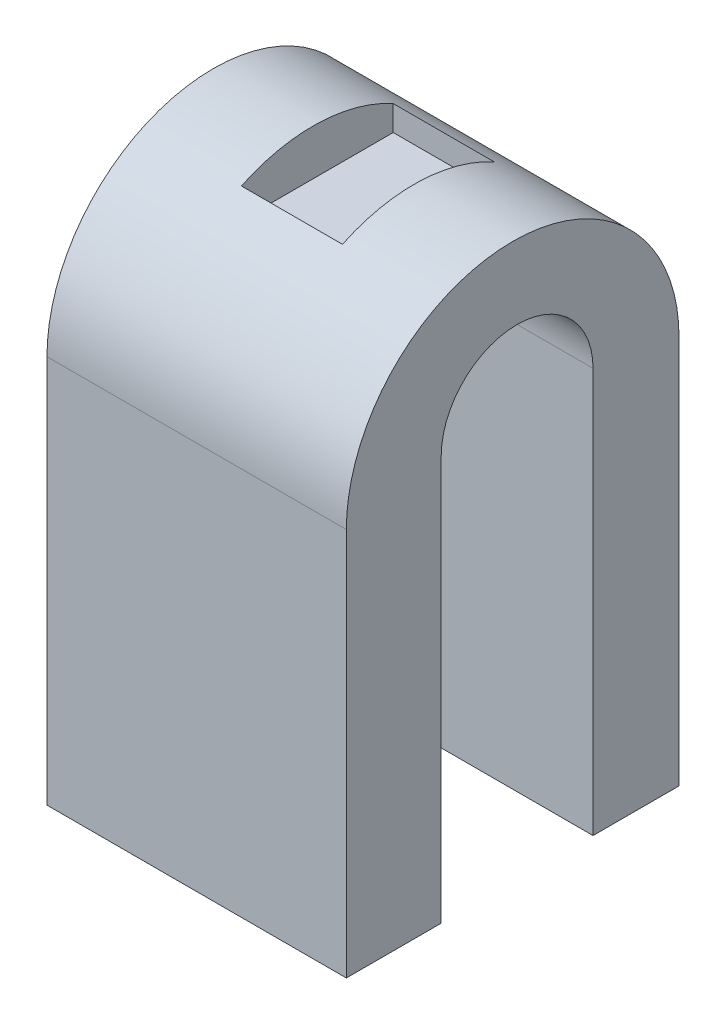
ISO-10303-21;
HEADER;
FILE_DESCRIPTION(('STEP AP214'),'2;1');
FILE_NAME('part.step','',(''),(''),'','','');
FILE_SCHEMA(('AUTOMOTIVE_DESIGN { 1 0 10303 214 1 1 1 1 }'));
ENDSEC;
DATA;
#1=APPLICATION_CONTEXT('core data for automotive mechanical design processes');
#2=APPLICATION_PROTOCOL_DEFINITION('international standard','automotive_design',2000,#1);
#3=PRODUCT_CONTEXT('',#1,'mechanical');
#4=PRODUCT('Part','Part','',(#3));
#5=PRODUCT_RELATED_PRODUCT_CATEGORY('part','',(#4));
#6=PRODUCT_DEFINITION_FORMATION('','',#4);
#7=PRODUCT_DEFINITION_CONTEXT('part definition',#1,'design');
#8=PRODUCT_DEFINITION('design','',#6,#7);
#9=PRODUCT_DEFINITION_SHAPE('','',#8);
#10=(LENGTH_UNIT() NAMED_UNIT(*) SI_UNIT(.MILLI.,.METRE.));
#11=(NAMED_UNIT(*) PLANE_ANGLE_UNIT() SI_UNIT($,.RADIAN.));
#12=(NAMED_UNIT(*) SI_UNIT($,.STERADIAN.) SOLID_ANGLE_UNIT());
#13=UNCERTAINTY_MEASURE_WITH_UNIT(LENGTH_MEASURE(1.E-05),#10,'distance_accuracy_value','');
#14=(GEOMETRIC_REPRESENTATION_CONTEXT(3) GLOBAL_UNCERTAINTY_ASSIGNED_CONTEXT((#13)) GLOBAL_UNIT_ASSIGNED_CONTEXT((#10,
#11,#12)) REPRESENTATION_CONTEXT('',''));
#15=CARTESIAN_POINT('',(0.,0.,0.));
#16=DIRECTION('',(0.,0.,1.));
#17=DIRECTION('',(1.,0.,0.));
#18=AXIS2_PLACEMENT_3D('',#15,#16,#17);
#19=CARTESIAN_POINT('',(50.,64.8618826991821,-27.7809166707894));
#20=DIRECTION('',(-1.,0.,0.));
#21=DIRECTION('',(0.,0.,1.));
#22=AXIS2_PLACEMENT_3D('',#19,#20,#21);
#23=CYLINDRICAL_SURFACE('',#22,27.7809166707894);
#24=CARTESIAN_POINT('',(0.,64.8618826991821,-27.7809166707894));
#25=DIRECTION('',(1.,0.,0.));
#26=DIRECTION('',(0.,0.,-1.));
#27=AXIS2_PLACEMENT_3D('',#24,#25,#26);
#28=CIRCLE('',#27,27.7809166707894);
#29=CARTESIAN_POINT('',(0.,64.8618826991821,-55.5618333415788));
#30=VERTEX_POINT('',#29);
#31=CARTESIAN_POINT('',(0.,64.8618826991821,0.));
#32=VERTEX_POINT('',#31);
#33=EDGE_CURVE('E202',#30,#32,#28,.T.);
#34=ORIENTED_EDGE('',*,*,#33,.T.);
#35=DIRECTION('',(-1.,0.,0.));
#36=VECTOR('',#35,1.);
#37=CARTESIAN_POINT('',(50.,64.8618826991821,0.));
#38=LINE('',#37,#36);
#39=CARTESIAN_POINT('',(50.,64.8618826991821,0.));
#40=VERTEX_POINT('',#39);
#41=EDGE_CURVE('E251',#40,#32,#38,.T.);
#42=ORIENTED_EDGE('',*,*,#41,.F.);
#43=CARTESIAN_POINT('',(50.,64.8618826991821,-27.7809166707894));
#44=DIRECTION('',(1.,0.,0.));
#45=DIRECTION('',(0.,0.,-1.));
#46=AXIS2_PLACEMENT_3D('',#43,#44,#45);
#47=CIRCLE('',#46,27.7809166707894);
#48=CARTESIAN_POINT('',(50.,64.8618826991821,-55.5618333415788));
#49=VERTEX_POINT('',#48);
#50=EDGE_CURVE('E210',#49,#40,#47,.T.);
#51=ORIENTED_EDGE('',*,*,#50,.F.);
#52=DIRECTION('',(-1.,0.,0.));
#53=VECTOR('',#52,1.);
#54=CARTESIAN_POINT('',(50.,64.8618826991821,-55.5618333415788));
#55=LINE('',#54,#53);
#56=EDGE_CURVE('E226',#49,#30,#55,.T.);
#57=ORIENTED_EDGE('',*,*,#56,.T.);
#58=EDGE_LOOP('',(#34,#42,#51,#57));
#59=FACE_BOUND('',#58,.T.);
#60=CARTESIAN_POINT('',(33.5085469946007,64.8618826991821,-27.7809166707894));
#61=DIRECTION('',(-1.,0.,0.));
#62=DIRECTION('',(0.,0.,1.));
#63=AXIS2_PLACEMENT_3D('',#60,#61,#62);
#64=CIRCLE('',#63,27.7809166707894);
#65=CARTESIAN_POINT('',(33.5085469946007,89.9470743785203,-15.8430571691783));
#66=VERTEX_POINT('',#65);
#67=CARTESIAN_POINT('',(33.5085469946007,89.1886886851724,-41.1967968725999));
#68=VERTEX_POINT('',#67);
#69=EDGE_CURVE('E254',#66,#68,#64,.T.);
#70=ORIENTED_EDGE('',*,*,#69,.F.);
#71=DIRECTION('',(-1.,0.,0.));
#72=VECTOR('',#71,1.);
#73=CARTESIAN_POINT('',(50.,89.9470743785203,-15.8430571691783));
#74=LINE('',#73,#72);
#75=CARTESIAN_POINT('',(16.6327028117731,89.9470743785203,-15.8430571691783));
#76=VERTEX_POINT('',#75);
#77=EDGE_CURVE('E11',#76,#66,#74,.F.);
#78=ORIENTED_EDGE('',*,*,#77,.F.);
#79=CARTESIAN_POINT('',(16.6327028117731,64.8618826991821,-27.7809166707894));
#80=DIRECTION('',(1.,0.,0.));
#81=DIRECTION('',(0.,0.,-1.));
#82=AXIS2_PLACEMENT_3D('',#79,#80,#81);
#83=CIRCLE('',#82,27.7809166707894);
#84=CARTESIAN_POINT('',(16.6327028117731,89.1886886851724,-41.1967968725999));
#85=VERTEX_POINT('',#84);
#86=EDGE_CURVE('E144',#85,#76,#83,.T.);
#87=ORIENTED_EDGE('',*,*,#86,.F.);
#88=DIRECTION('',(-1.,0.,0.));
#89=VECTOR('',#88,1.);
#90=CARTESIAN_POINT('',(50.,89.1886886851724,-41.1967968725999));
#91=LINE('',#90,#89);
#92=EDGE_CURVE('E55',#68,#85,#91,.T.);
#93=ORIENTED_EDGE('',*,*,#92,.F.);
#94=EDGE_LOOP('',(#70,#78,#87,#93));
#95=FACE_BOUND('',#94,.T.);
#96=ADVANCED_FACE('F47',(#59,#95),#23,.T.);
#97=CARTESIAN_POINT('',(50.,0.,0.));
#98=DIRECTION('',(0.,1.,0.));
#99=DIRECTION('',(0.,0.,1.));
#100=AXIS2_PLACEMENT_3D('',#97,#98,#99);
#101=PLANE('',#100);
#102=DIRECTION('',(1.,0.,0.));
#103=VECTOR('',#102,1.);
#104=CARTESIAN_POINT('',(0.,0.,-41.1967968725999));
#105=LINE('',#104,#103);
#106=CARTESIAN_POINT('',(0.,0.,-41.1967968725999));
#107=VERTEX_POINT('',#106);
#108=CARTESIAN_POINT('',(50.,0.,-41.1967968725999));
#109=VERTEX_POINT('',#108);
#110=EDGE_CURVE('E203',#107,#109,#105,.T.);
#111=ORIENTED_EDGE('',*,*,#110,.F.);
#112=DIRECTION('',(0.,0.,-1.));
#113=VECTOR('',#112,1.);
#114=CARTESIAN_POINT('',(0.,0.,0.));
#115=LINE('',#114,#113);
#116=CARTESIAN_POINT('',(0.,0.,-55.5618333415788));
#117=VERTEX_POINT('',#116);
#118=EDGE_CURVE('E234',#107,#117,#115,.T.);
#119=ORIENTED_EDGE('',*,*,#118,.T.);
#120=DIRECTION('',(-1.,0.,0.));
#121=VECTOR('',#120,1.);
#122=CARTESIAN_POINT('',(50.,0.,-55.5618333415788));
#123=LINE('',#122,#121);
#124=CARTESIAN_POINT('',(50.,0.,-55.5618333415788));
#125=VERTEX_POINT('',#124);
#126=EDGE_CURVE('E244',#125,#117,#123,.T.);
#127=ORIENTED_EDGE('',*,*,#126,.F.);
#128=DIRECTION('',(0.,0.,-1.));
#129=VECTOR('',#128,1.);
#130=CARTESIAN_POINT('',(50.,0.,0.));
#131=LINE('',#130,#129);
#132=EDGE_CURVE('E218',#109,#125,#131,.T.);
#133=ORIENTED_EDGE('',*,*,#132,.F.);
#134=EDGE_LOOP('',(#111,#119,#127,#133));
#135=FACE_BOUND('',#134,.T.);
#136=ADVANCED_FACE('F273',(#135),#101,.F.);
#137=CARTESIAN_POINT('',(50.,0.,0.));
#138=DIRECTION('',(1.,0.,0.));
#139=DIRECTION('',(0.,0.,-1.));
#140=AXIS2_PLACEMENT_3D('',#137,#138,#139);
#141=PLANE('',#140);
#142=CARTESIAN_POINT('',(50.,67.5821589878552,-28.5199270208891));
#143=DIRECTION('',(1.,0.,0.));
#144=DIRECTION('',(0.,0.,-1.));
#145=AXIS2_PLACEMENT_3D('',#142,#143,#144);
#146=CIRCLE('',#145,12.6768698517108);
#147=CARTESIAN_POINT('',(50.,67.5821589878552,-41.1967968725999));
#148=VERTEX_POINT('',#147);
#149=CARTESIAN_POINT('',(50.,67.5821589878552,-15.8430571691783));
#150=VERTEX_POINT('',#149);
#151=EDGE_CURVE('E148',#148,#150,#146,.T.);
#152=ORIENTED_EDGE('',*,*,#151,.F.);
#153=DIRECTION('',(0.,-1.,0.));
#154=VECTOR('',#153,1.);
#155=CARTESIAN_POINT('',(50.,0.,-41.1967968725999));
#156=LINE('',#155,#154);
#157=EDGE_CURVE('E183',#148,#109,#156,.T.);
#158=ORIENTED_EDGE('',*,*,#157,.T.);
#159=ORIENTED_EDGE('',*,*,#132,.T.);
#160=DIRECTION('',(0.,1.,0.));
#161=VECTOR('',#160,1.);
#162=CARTESIAN_POINT('',(50.,0.,-55.5618333415788));
#163=LINE('',#162,#161);
#164=EDGE_CURVE('E223',#125,#49,#163,.T.);
#165=ORIENTED_EDGE('',*,*,#164,.T.);
#166=ORIENTED_EDGE('',*,*,#50,.T.);
#167=DIRECTION('',(0.,1.,0.));
#168=VECTOR('',#167,1.);
#169=CARTESIAN_POINT('',(50.,0.,0.));
#170=LINE('',#169,#168);
#171=CARTESIAN_POINT('',(50.,0.,0.));
#172=VERTEX_POINT('',#171);
#173=EDGE_CURVE('E213',#172,#40,#170,.T.);
#174=ORIENTED_EDGE('',*,*,#173,.F.);
#175=CARTESIAN_POINT('',(50.,0.,-15.8430571691783));
#176=VERTEX_POINT('',#175);
#177=EDGE_CURVE('E219',#172,#176,#131,.T.);
#178=ORIENTED_EDGE('',*,*,#177,.T.);
#179=DIRECTION('',(0.,-1.,0.));
#180=VECTOR('',#179,1.);
#181=CARTESIAN_POINT('',(50.,0.,-15.8430571691783));
#182=LINE('',#181,#180);
#183=EDGE_CURVE('E193',#150,#176,#182,.T.);
#184=ORIENTED_EDGE('',*,*,#183,.F.);
#185=EDGE_LOOP('',(#152,#158,#159,#165,#166,#174,#178,#184));
#186=FACE_BOUND('',#185,.T.);
#187=ADVANCED_FACE('F280',(#186),#141,.T.);
#188=CARTESIAN_POINT('',(0.,0.,0.));
#189=DIRECTION('',(1.,0.,0.));
#190=DIRECTION('',(0.,0.,-1.));
#191=AXIS2_PLACEMENT_3D('',#188,#189,#190);
#192=PLANE('',#191);
#193=DIRECTION('',(0.,-1.,0.));
#194=VECTOR('',#193,1.);
#195=CARTESIAN_POINT('',(0.,0.,-41.1967968725999));
#196=LINE('',#195,#194);
#197=CARTESIAN_POINT('',(0.,67.5821589878552,-41.1967968725999));
#198=VERTEX_POINT('',#197);
#199=EDGE_CURVE('E186',#198,#107,#196,.T.);
#200=ORIENTED_EDGE('',*,*,#199,.F.);
#201=CARTESIAN_POINT('',(0.,67.5821589878552,-28.5199270208891));
#202=DIRECTION('',(1.,0.,0.));
#203=DIRECTION('',(0.,0.,-1.));
#204=AXIS2_PLACEMENT_3D('',#201,#202,#203);
#205=CIRCLE('',#204,12.6768698517108);
#206=CARTESIAN_POINT('',(0.,67.5821589878552,-15.8430571691783));
#207=VERTEX_POINT('',#206);
#208=EDGE_CURVE('E178',#198,#207,#205,.T.);
#209=ORIENTED_EDGE('',*,*,#208,.T.);
#210=DIRECTION('',(0.,-1.,0.));
#211=VECTOR('',#210,1.);
#212=CARTESIAN_POINT('',(0.,0.,-15.8430571691783));
#213=LINE('',#212,#211);
#214=CARTESIAN_POINT('',(0.,0.,-15.8430571691783));
#215=VERTEX_POINT('',#214);
#216=EDGE_CURVE('E182',#207,#215,#213,.T.);
#217=ORIENTED_EDGE('',*,*,#216,.T.);
#218=CARTESIAN_POINT('',(0.,0.,0.));
#219=VERTEX_POINT('',#218);
#220=EDGE_CURVE('E235',#219,#215,#115,.T.);
#221=ORIENTED_EDGE('',*,*,#220,.F.);
#222=DIRECTION('',(0.,1.,0.));
#223=VECTOR('',#222,1.);
#224=CARTESIAN_POINT('',(0.,0.,0.));
#225=LINE('',#224,#223);
#226=EDGE_CURVE('E230',#219,#32,#225,.T.);
#227=ORIENTED_EDGE('',*,*,#226,.T.);
#228=ORIENTED_EDGE('',*,*,#33,.F.);
#229=DIRECTION('',(0.,1.,0.));
#230=VECTOR('',#229,1.);
#231=CARTESIAN_POINT('',(0.,0.,-55.5618333415788));
#232=LINE('',#231,#230);
#233=EDGE_CURVE('E214',#117,#30,#232,.T.);
#234=ORIENTED_EDGE('',*,*,#233,.F.);
#235=ORIENTED_EDGE('',*,*,#118,.F.);
#236=EDGE_LOOP('',(#200,#209,#217,#221,#227,#228,#234,#235));
#237=FACE_BOUND('',#236,.T.);
#238=ADVANCED_FACE('F293',(#237),#192,.F.);
#239=CARTESIAN_POINT('',(50.,0.,0.));
#240=DIRECTION('',(0.,0.,1.));
#241=DIRECTION('',(1.,0.,0.));
#242=AXIS2_PLACEMENT_3D('',#239,#240,#241);
#243=PLANE('',#242);
#244=ORIENTED_EDGE('',*,*,#226,.F.);
#245=DIRECTION('',(-1.,0.,0.));
#246=VECTOR('',#245,1.);
#247=CARTESIAN_POINT('',(50.,0.,0.));
#248=LINE('',#247,#246);
#249=EDGE_CURVE('E248',#172,#219,#248,.T.);
#250=ORIENTED_EDGE('',*,*,#249,.F.);
#251=ORIENTED_EDGE('',*,*,#173,.T.);
#252=ORIENTED_EDGE('',*,*,#41,.T.);
#253=EDGE_LOOP('',(#244,#250,#251,#252));
#254=FACE_BOUND('',#253,.T.);
#255=ADVANCED_FACE('F295',(#254),#243,.T.);
#256=ORIENTED_EDGE('',*,*,#220,.T.);
#257=DIRECTION('',(1.,0.,0.));
#258=VECTOR('',#257,1.);
#259=CARTESIAN_POINT('',(0.,0.,-15.8430571691783));
#260=LINE('',#259,#258);
#261=EDGE_CURVE('E70',#215,#176,#260,.T.);
#262=ORIENTED_EDGE('',*,*,#261,.T.);
#263=ORIENTED_EDGE('',*,*,#177,.F.);
#264=ORIENTED_EDGE('',*,*,#249,.T.);
#265=EDGE_LOOP('',(#256,#262,#263,#264));
#266=FACE_BOUND('',#265,.T.);
#267=ADVANCED_FACE('F283',(#266),#101,.F.);
#268=CARTESIAN_POINT('',(50.,0.,-55.5618333415788));
#269=DIRECTION('',(0.,0.,1.));
#270=DIRECTION('',(1.,0.,0.));
#271=AXIS2_PLACEMENT_3D('',#268,#269,#270);
#272=PLANE('',#271);
#273=ORIENTED_EDGE('',*,*,#233,.T.);
#274=ORIENTED_EDGE('',*,*,#56,.F.);
#275=ORIENTED_EDGE('',*,*,#164,.F.);
#276=ORIENTED_EDGE('',*,*,#126,.T.);
#277=EDGE_LOOP('',(#273,#274,#275,#276));
#278=FACE_BOUND('',#277,.T.);
#279=ADVANCED_FACE('F305',(#278),#272,.F.);
#280=CARTESIAN_POINT('',(0.,67.5821589878552,-28.5199270208891));
#281=DIRECTION('',(1.,0.,0.));
#282=DIRECTION('',(0.,0.,-1.));
#283=AXIS2_PLACEMENT_3D('',#280,#281,#282);
#284=CYLINDRICAL_SURFACE('',#283,12.6768698517108);
#285=ORIENTED_EDGE('',*,*,#151,.T.);
#286=DIRECTION('',(1.,0.,0.));
#287=VECTOR('',#286,1.);
#288=CARTESIAN_POINT('',(0.,67.5821589878552,-15.8430571691783));
#289=LINE('',#288,#287);
#290=EDGE_CURVE('E189',#207,#150,#289,.T.);
#291=ORIENTED_EDGE('',*,*,#290,.F.);
#292=ORIENTED_EDGE('',*,*,#208,.F.);
#293=DIRECTION('',(1.,0.,0.));
#294=VECTOR('',#293,1.);
#295=CARTESIAN_POINT('',(0.,67.5821589878552,-41.1967968725999));
#296=LINE('',#295,#294);
#297=EDGE_CURVE('E199',#198,#148,#296,.T.);
#298=ORIENTED_EDGE('',*,*,#297,.T.);
#299=EDGE_LOOP('',(#285,#291,#292,#298));
#300=FACE_BOUND('',#299,.T.);
#301=ADVANCED_FACE('F314',(#300),#284,.F.);
#302=CARTESIAN_POINT('',(0.,0.,-41.1967968725999));
#303=DIRECTION('',(0.,0.,1.));
#304=DIRECTION('',(1.,0.,0.));
#305=AXIS2_PLACEMENT_3D('',#302,#303,#304);
#306=PLANE('',#305);
#307=ORIENTED_EDGE('',*,*,#157,.F.);
#308=ORIENTED_EDGE('',*,*,#297,.F.);
#309=ORIENTED_EDGE('',*,*,#199,.T.);
#310=ORIENTED_EDGE('',*,*,#110,.T.);
#311=EDGE_LOOP('',(#307,#308,#309,#310));
#312=FACE_BOUND('',#311,.T.);
#313=ADVANCED_FACE('F312',(#312),#306,.T.);
#314=CARTESIAN_POINT('',(0.,0.,-15.8430571691783));
#315=DIRECTION('',(0.,0.,1.));
#316=DIRECTION('',(1.,0.,0.));
#317=AXIS2_PLACEMENT_3D('',#314,#315,#316);
#318=PLANE('',#317);
#319=ORIENTED_EDGE('',*,*,#183,.T.);
#320=ORIENTED_EDGE('',*,*,#261,.F.);
#321=ORIENTED_EDGE('',*,*,#216,.F.);
#322=ORIENTED_EDGE('',*,*,#290,.T.);
#323=EDGE_LOOP('',(#319,#320,#321,#322));
#324=FACE_BOUND('',#323,.T.);
#325=ADVANCED_FACE('F330',(#324),#318,.F.);
#326=CARTESIAN_POINT('',(16.6327028117731,92.6427993699715,-41.1967968725999));
#327=DIRECTION('',(1.,0.,0.));
#328=DIRECTION('',(0.,0.,-1.));
#329=AXIS2_PLACEMENT_3D('',#326,#327,#328);
#330=PLANE('',#329);
#331=DIRECTION('',(0.,-1.,0.));
#332=VECTOR('',#331,1.);
#333=CARTESIAN_POINT('',(16.6327028117731,92.6427993699715,-41.1967968725999));
#334=LINE('',#333,#332);
#335=CARTESIAN_POINT('',(16.6327028117731,85.,-41.1967968725999));
#336=VERTEX_POINT('',#335);
#337=EDGE_CURVE('E171',#85,#336,#334,.T.);
#338=ORIENTED_EDGE('',*,*,#337,.F.);
#339=ORIENTED_EDGE('',*,*,#86,.T.);
#340=DIRECTION('',(0.,-1.,0.));
#341=VECTOR('',#340,1.);
#342=CARTESIAN_POINT('',(16.6327028117731,92.6427993699715,-15.8430571691783));
#343=LINE('',#342,#341);
#344=CARTESIAN_POINT('',(16.6327028117731,85.,-15.8430571691783));
#345=VERTEX_POINT('',#344);
#346=EDGE_CURVE('E138',#76,#345,#343,.T.);
#347=ORIENTED_EDGE('',*,*,#346,.T.);
#348=DIRECTION('',(0.,0.,1.));
#349=VECTOR('',#348,1.);
#350=CARTESIAN_POINT('',(16.6327028117731,85.,-41.1967968725999));
#351=LINE('',#350,#349);
#352=EDGE_CURVE('E143',#336,#345,#351,.T.);
#353=ORIENTED_EDGE('',*,*,#352,.F.);
#354=EDGE_LOOP('',(#338,#339,#347,#353));
#355=FACE_BOUND('',#354,.T.);
#356=ADVANCED_FACE('F141',(#355),#330,.T.);
#357=CARTESIAN_POINT('',(16.6327028117731,92.6427993699715,-15.8430571691783));
#358=DIRECTION('',(0.,0.,-1.));
#359=DIRECTION('',(-1.,0.,0.));
#360=AXIS2_PLACEMENT_3D('',#357,#358,#359);
#361=PLANE('',#360);
#362=ORIENTED_EDGE('',*,*,#77,.T.);
#363=DIRECTION('',(0.,-1.,0.));
#364=VECTOR('',#363,1.);
#365=CARTESIAN_POINT('',(33.5085469946007,92.6427993699715,-15.8430571691783));
#366=LINE('',#365,#364);
#367=CARTESIAN_POINT('',(33.5085469946007,85.,-15.8430571691783));
#368=VERTEX_POINT('',#367);
#369=EDGE_CURVE('E149',#66,#368,#366,.T.);
#370=ORIENTED_EDGE('',*,*,#369,.T.);
#371=DIRECTION('',(1.,0.,0.));
#372=VECTOR('',#371,1.);
#373=CARTESIAN_POINT('',(16.6327028117731,85.,-15.8430571691783));
#374=LINE('',#373,#372);
#375=EDGE_CURVE('E152',#345,#368,#374,.T.);
#376=ORIENTED_EDGE('',*,*,#375,.F.);
#377=ORIENTED_EDGE('',*,*,#346,.F.);
#378=EDGE_LOOP('',(#362,#370,#376,#377));
#379=FACE_BOUND('',#378,.T.);
#380=ADVANCED_FACE('F153',(#379),#361,.T.);
#381=CARTESIAN_POINT('',(33.5085469946007,92.6427993699715,-41.1967968725999));
#382=DIRECTION('',(-1.,0.,0.));
#383=DIRECTION('',(0.,0.,1.));
#384=AXIS2_PLACEMENT_3D('',#381,#382,#383);
#385=PLANE('',#384);
#386=ORIENTED_EDGE('',*,*,#369,.F.);
#387=ORIENTED_EDGE('',*,*,#69,.T.);
#388=DIRECTION('',(0.,-1.,0.));
#389=VECTOR('',#388,1.);
#390=CARTESIAN_POINT('',(33.5085469946007,92.6427993699715,-41.1967968725999));
#391=LINE('',#390,#389);
#392=CARTESIAN_POINT('',(33.5085469946007,85.,-41.1967968725999));
#393=VERTEX_POINT('',#392);
#394=EDGE_CURVE('E62',#68,#393,#391,.T.);
#395=ORIENTED_EDGE('',*,*,#394,.T.);
#396=DIRECTION('',(0.,0.,-1.));
#397=VECTOR('',#396,1.);
#398=CARTESIAN_POINT('',(33.5085469946007,85.,-41.1967968725999));
#399=LINE('',#398,#397);
#400=EDGE_CURVE('E159',#368,#393,#399,.T.);
#401=ORIENTED_EDGE('',*,*,#400,.F.);
#402=EDGE_LOOP('',(#386,#387,#395,#401));
#403=FACE_BOUND('',#402,.T.);
#404=ADVANCED_FACE('F263',(#403),#385,.T.);
#405=CARTESIAN_POINT('',(16.6327028117731,92.6427993699715,-41.1967968725999));
#406=DIRECTION('',(0.,0.,1.));
#407=DIRECTION('',(1.,0.,0.));
#408=AXIS2_PLACEMENT_3D('',#405,#406,#407);
#409=PLANE('',#408);
#410=ORIENTED_EDGE('',*,*,#92,.T.);
#411=ORIENTED_EDGE('',*,*,#337,.T.);
#412=DIRECTION('',(-1.,0.,0.));
#413=VECTOR('',#412,1.);
#414=CARTESIAN_POINT('',(16.6327028117731,85.,-41.1967968725999));
#415=LINE('',#414,#413);
#416=EDGE_CURVE('E163',#393,#336,#415,.T.);
#417=ORIENTED_EDGE('',*,*,#416,.F.);
#418=ORIENTED_EDGE('',*,*,#394,.F.);
#419=EDGE_LOOP('',(#410,#411,#417,#418));
#420=FACE_BOUND('',#419,.T.);
#421=ADVANCED_FACE('F260',(#420),#409,.T.);
#422=CARTESIAN_POINT('',(0.,85.,0.));
#423=DIRECTION('',(0.,1.,0.));
#424=DIRECTION('',(0.,0.,1.));
#425=AXIS2_PLACEMENT_3D('',#422,#423,#424);
#426=PLANE('',#425);
#427=ORIENTED_EDGE('',*,*,#352,.T.);
#428=ORIENTED_EDGE('',*,*,#375,.T.);
#429=ORIENTED_EDGE('',*,*,#400,.T.);
#430=ORIENTED_EDGE('',*,*,#416,.T.);
#431=EDGE_LOOP('',(#427,#428,#429,#430));
#432=FACE_BOUND('',#431,.T.);
#433=ADVANCED_FACE('F162',(#432),#426,.T.);
#434=CLOSED_SHELL('',(#96,#136,#187,#238,#255,#267,#279,#301,#313,#325,#356,#380,#404,#421,#433));
#435=MANIFOLD_SOLID_BREP('B2',#434);
#436=ADVANCED_BREP_SHAPE_REPRESENTATION('',(#18,#435),#14);
#437=SHAPE_DEFINITION_REPRESENTATION(#9,#436);
ENDSEC;
END-ISO-10303-21;
